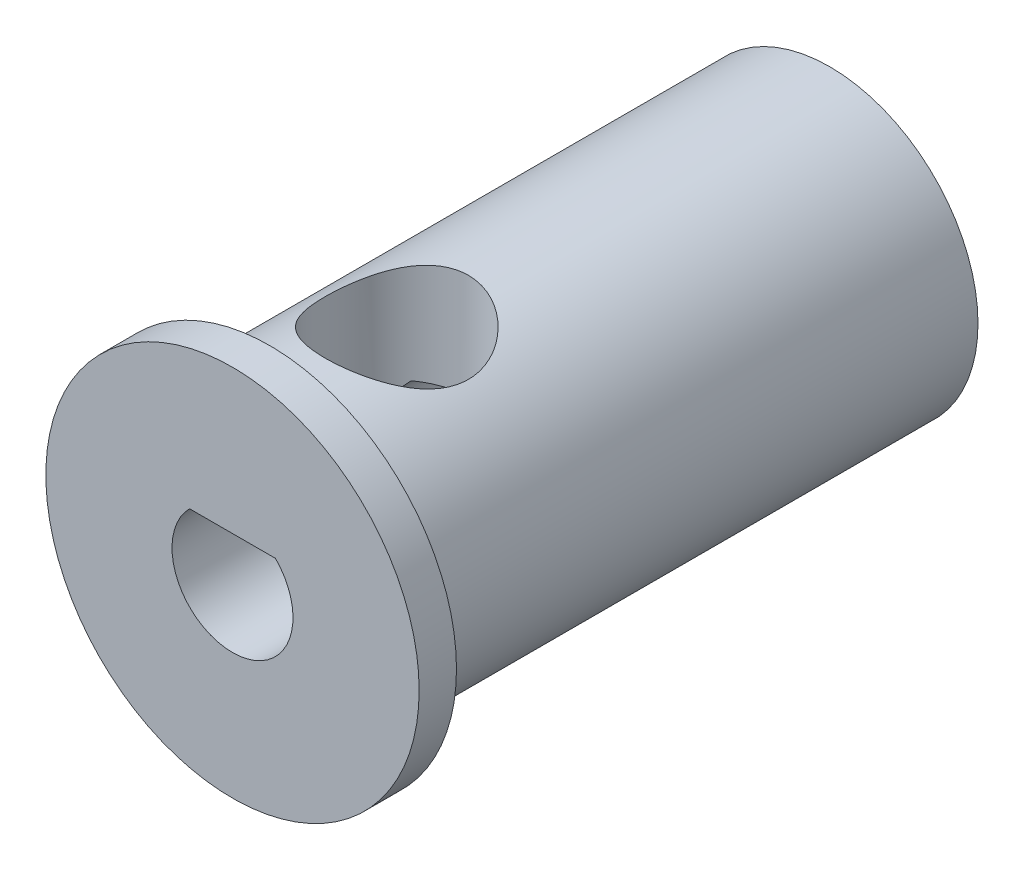
ISO-10303-21;
HEADER;
FILE_DESCRIPTION(('STEP AP214'),'2;1');
FILE_NAME('part.step','',(''),(''),'','','');
FILE_SCHEMA(('AUTOMOTIVE_DESIGN { 1 0 10303 214 1 1 1 1 }'));
ENDSEC;
DATA;
#1=APPLICATION_CONTEXT('core data for automotive mechanical design processes');
#2=APPLICATION_PROTOCOL_DEFINITION('international standard','automotive_design',2000,#1);
#3=PRODUCT_CONTEXT('',#1,'mechanical');
#4=PRODUCT('Part','Part','',(#3));
#5=PRODUCT_RELATED_PRODUCT_CATEGORY('part','',(#4));
#6=PRODUCT_DEFINITION_FORMATION('','',#4);
#7=PRODUCT_DEFINITION_CONTEXT('part definition',#1,'design');
#8=PRODUCT_DEFINITION('design','',#6,#7);
#9=PRODUCT_DEFINITION_SHAPE('','',#8);
#10=(LENGTH_UNIT() NAMED_UNIT(*) SI_UNIT(.MILLI.,.METRE.));
#11=(NAMED_UNIT(*) PLANE_ANGLE_UNIT() SI_UNIT($,.RADIAN.));
#12=(NAMED_UNIT(*) SI_UNIT($,.STERADIAN.) SOLID_ANGLE_UNIT());
#13=UNCERTAINTY_MEASURE_WITH_UNIT(LENGTH_MEASURE(1.E-05),#10,'distance_accuracy_value','');
#14=(GEOMETRIC_REPRESENTATION_CONTEXT(3) GLOBAL_UNCERTAINTY_ASSIGNED_CONTEXT((#13)) GLOBAL_UNIT_ASSIGNED_CONTEXT((#10,
#11,#12)) REPRESENTATION_CONTEXT('',''));
#15=CARTESIAN_POINT('',(0.,0.,0.));
#16=DIRECTION('',(0.,0.,1.));
#17=DIRECTION('',(1.,0.,0.));
#18=AXIS2_PLACEMENT_3D('',#15,#16,#17);
#19=CARTESIAN_POINT('',(0.,0.,19.05));
#20=DIRECTION('',(0.,0.,-1.));
#21=DIRECTION('',(-1.,0.,0.));
#22=AXIS2_PLACEMENT_3D('',#19,#20,#21);
#23=CYLINDRICAL_SURFACE('',#22,2.0574);
#24=CARTESIAN_POINT('',(-1.46176944830572,1.4478,16.6836722675695));
#25=CARTESIAN_POINT('',(-1.50519206628819,1.40393112188125,16.6511612609502));
#26=CARTESIAN_POINT('',(-1.54641966982627,1.35838515069615,16.6180095134758));
#27=CARTESIAN_POINT('',(-1.62452478522064,1.26395928808297,16.5511611275381));
#28=CARTESIAN_POINT('',(-1.66139721220871,1.21507560273191,16.5174639033702));
#29=CARTESIAN_POINT('',(-1.7312439647107,1.11334995902762,16.4498437644032));
#30=CARTESIAN_POINT('',(-1.7641526047677,1.060460167501,16.4159248775956));
#31=CARTESIAN_POINT('',(-1.82532169227734,0.951318476338173,16.3494161396357));
#32=CARTESIAN_POINT('',(-1.85358526275403,0.895068870586818,16.3168254067026));
#33=CARTESIAN_POINT('',(-1.91036444974198,0.767585453453801,16.2481294222542));
#34=CARTESIAN_POINT('',(-1.93784489045503,0.695574842274011,16.2125863073743));
#35=CARTESIAN_POINT('',(-1.98508226913828,0.546287388131393,16.1486228220648));
#36=CARTESIAN_POINT('',(-2.00487272011191,0.469035159306943,16.120171743594));
#37=CARTESIAN_POINT('',(-2.03230681225367,0.326622374320476,16.0795894308021));
#38=CARTESIAN_POINT('',(-2.04164798322301,0.262437628538028,16.0652637058874));
#39=CARTESIAN_POINT('',(-2.05419099934086,0.1321281191434,16.0458632716218));
#40=CARTESIAN_POINT('',(-2.05740374432613,0.0660070126349541,16.040772138693));
#41=CARTESIAN_POINT('',(-2.0573962411417,-0.0663799692440312,16.04078384334));
#42=CARTESIAN_POINT('',(-2.05416188417866,-0.132645844419653,16.0459090382574));
#43=CARTESIAN_POINT('',(-2.04154964803655,-0.263240700814713,16.0654151297025));
#44=CARTESIAN_POINT('',(-2.03215954918969,-0.32756556273067,16.0798144351245));
#45=CARTESIAN_POINT('',(-2.00249448074515,-0.481117963792243,16.1236794548613));
#46=CARTESIAN_POINT('',(-1.97923062323135,-0.568629847005579,16.1570023703137));
#47=CARTESIAN_POINT('',(-1.92301273529276,-0.736772826713629,16.2320061803082));
#48=CARTESIAN_POINT('',(-1.89002324061015,-0.817377322332805,16.2737174827598));
#49=CARTESIAN_POINT('',(-1.82412384580341,-0.953811916607055,16.3507359800795));
#50=CARTESIAN_POINT('',(-1.79303208807592,-1.01099981570697,16.3852317827931));
#51=CARTESIAN_POINT('',(-1.72589853297051,-1.12176982261917,16.4552020662133));
#52=CARTESIAN_POINT('',(-1.68985427100158,-1.17535011521657,16.4906770271252));
#53=CARTESIAN_POINT('',(-1.57443628690646,-1.33067204160933,16.5968945713104));
#54=CARTESIAN_POINT('',(-1.48768034517329,-1.42719399728141,16.6675502997746));
#55=CARTESIAN_POINT('',(-1.31339884394821,-1.587136741894,16.7886460708021));
#56=CARTESIAN_POINT('',(-1.22929020592124,-1.65334614453058,16.8403482409517));
#57=CARTESIAN_POINT('',(-1.04863601539109,-1.77340615402986,16.9357545581393));
#58=CARTESIAN_POINT('',(-0.952112807739071,-1.82727849327907,16.9794727414331));
#59=CARTESIAN_POINT('',(-0.766945052576345,-1.9112848896966,17.0483444605489));
#60=CARTESIAN_POINT('',(-0.680187677445502,-1.94397223784251,17.0754396259506));
#61=CARTESIAN_POINT('',(-0.500794616570107,-1.99771012938167,17.1202048118993));
#62=CARTESIAN_POINT('',(-0.408162400749684,-2.01876747187716,17.1378803391169));
#63=CARTESIAN_POINT('',(-0.218967211244996,-2.0479618824641,17.1624288772043));
#64=CARTESIAN_POINT('',(-0.122387155504576,-2.05603493820469,17.1692483662838));
#65=CARTESIAN_POINT('',(0.0710651366325389,-2.058444991503,17.1712815774507));
#66=CARTESIAN_POINT('',(0.167937329056345,-2.05278396242986,17.1664969668624));
#67=CARTESIAN_POINT('',(0.351055338617932,-2.02916190407631,17.1466143564099));
#68=CARTESIAN_POINT('',(0.437531599879201,-2.01222024763185,17.1323713295755));
#69=CARTESIAN_POINT('',(0.605917128118689,-1.96808046889884,17.0954919130068));
#70=CARTESIAN_POINT('',(0.687825688732149,-1.94088076529193,17.0728542292121));
#71=CARTESIAN_POINT('',(0.851308426574243,-1.87522758570068,17.0187023899565));
#72=CARTESIAN_POINT('',(0.932439790078999,-1.83610841383023,16.9866692175147));
#73=CARTESIAN_POINT('',(1.08692033994308,-1.74910618550832,16.9164030874487));
#74=CARTESIAN_POINT('',(1.16026373095412,-1.7012166738969,16.8781655656681));
#75=CARTESIAN_POINT('',(1.33259339246107,-1.57277579097107,16.7775361604538));
#76=CARTESIAN_POINT('',(1.42664164448741,-1.48768557728443,16.7124588184173));
#77=CARTESIAN_POINT('',(1.59666597224789,-1.30358481103171,16.5781309524719));
#78=CARTESIAN_POINT('',(1.67260009201605,-1.20454277045228,16.5088711970223));
#79=CARTESIAN_POINT('',(1.79248474438531,-1.01478515218845,16.3868545202333));
#80=CARTESIAN_POINT('',(1.83979973191277,-0.92648882539618,16.3336119120111));
#81=CARTESIAN_POINT('',(1.92206508897937,-0.74083005882924,16.2338622019753));
#82=CARTESIAN_POINT('',(1.9570530464539,-0.643496343493173,16.1873348844232));
#83=CARTESIAN_POINT('',(2.00218355544554,-0.477962013063402,16.1241073242486));
#84=CARTESIAN_POINT('',(2.01671446228039,-0.412762090219479,16.1027933516637));
#85=CARTESIAN_POINT('',(2.03949288253413,-0.279163558741945,16.0686704453499));
#86=CARTESIAN_POINT('',(2.04775599300597,-0.210773342625285,16.0558404101093));
#87=CARTESIAN_POINT('',(2.05734223816155,-0.0716229439490773,16.0409047407842));
#88=CARTESIAN_POINT('',(2.05860012818988,-0.000846637597273574,16.0388999350702));
#89=CARTESIAN_POINT('',(2.05385075392474,0.139867521487288,16.0463451827528));
#90=CARTESIAN_POINT('',(2.04783681163789,0.209804543872385,16.0558057652591));
#91=CARTESIAN_POINT('',(2.0273144454087,0.360206363733491,16.0870608857868));
#92=CARTESIAN_POINT('',(2.01136272853382,0.440021817359107,16.1109226590397));
#93=CARTESIAN_POINT('',(1.9712992602855,0.594377936243893,16.167607787309));
#94=CARTESIAN_POINT('',(1.94715470433295,0.668895916100501,16.2004670650872));
#95=CARTESIAN_POINT('',(1.8969155732351,0.799067187762652,16.2645944261124));
#96=CARTESIAN_POINT('',(1.87203952543899,0.855634472978011,16.2950016823351));
#97=CARTESIAN_POINT('',(1.81782587544743,0.965483966390125,16.3577396967499));
#98=CARTESIAN_POINT('',(1.78848508798933,1.01876379077789,16.3900718180858));
#99=CARTESIAN_POINT('',(1.69409147604015,1.17369677897956,16.4881399240421));
#100=CARTESIAN_POINT('',(1.62253567207356,1.27077785784319,16.5551271820125));
#101=CARTESIAN_POINT('',(1.52958702555296,1.37609715491529,16.6310645240224));
#102=CARTESIAN_POINT('',(1.51633118394945,1.39069160233779,16.6416674825479));
#103=CARTESIAN_POINT('',(1.48938302702622,1.41951499540378,16.662757016479));
#104=CARTESIAN_POINT('',(1.47569126576392,1.43374436652407,16.6732437184435));
#105=CARTESIAN_POINT('',(1.46176944830574,1.44780000000002,16.6836722675695));
#106=B_SPLINE_CURVE_WITH_KNOTS('',3,(#24,#25,#26,#27,#28,#29,#30,#31,#32,#33,#34,#35,#36,#37,
#38,#39,#40,#41,#42,#43,#44,#45,#46,#47,#48,#49,#50,#51,#52,#53,#54,#55,#56,#57,#58,#59,#60,#61,
#62,#63,#64,#65,#66,#67,#68,#69,#70,#71,#72,#73,#74,#75,#76,#77,#78,#79,#80,#81,#82,#83,#84,#85,
#86,#87,#88,#89,#90,#91,#92,#93,#94,#95,#96,#97,#98,#99,#100,#101,#102,#103,#104,#105),
.UNSPECIFIED.,.F.,.F.,(4,2,2,2,2,2,2,2,2,2,2,2,2,2,2,2,2,2,2,2,2,2,2,2,2,2,2,2,2,2,2,2,2,2,2,2,
2,2,2,2,4),(0.,0.209214934902574,0.418671772548596,0.631225087465833,0.843634906363585,
1.09765356996514,1.35055245950274,1.54902383530508,1.74714188546865,1.94569397179676,
2.14464139917522,2.43248454886869,2.72139057411086,2.94212328547115,3.16296624400749,
3.60390394942574,3.95926812663508,4.31400141151972,4.60258642261468,4.89100254285878,
5.18083623965345,5.47062829443067,5.73725580849062,6.00392444104277,6.2896636052093,
6.57561393104608,7.00101743720801,7.42739689880439,7.76684659112921,8.10525207844378,
8.31494070033158,8.52410579658117,8.73521578041091,8.94651978169992,9.19956371837157,
9.45363305290759,9.65997056975858,9.86645598942673,10.2782338339173,10.345391351189,
10.4124666742462),.UNSPECIFIED.);
#107=CARTESIAN_POINT('',(-1.46176944830572,1.4478,16.6836722675695));
#108=VERTEX_POINT('',#107);
#109=CARTESIAN_POINT('',(1.46176944830572,1.4478,16.6836722675695));
#110=VERTEX_POINT('',#109);
#111=EDGE_CURVE('E95',#108,#110,#106,.T.);
#112=ORIENTED_EDGE('',*,*,#111,.F.);
#113=DIRECTION('',(0.,0.,-1.));
#114=VECTOR('',#113,1.);
#115=CARTESIAN_POINT('',(-1.46176944830572,1.4478,22.0364178944013));
#116=LINE('',#115,#114);
#117=CARTESIAN_POINT('',(-1.46176944830572,1.4478,20.32));
#118=VERTEX_POINT('',#117);
#119=EDGE_CURVE('E91',#118,#108,#116,.T.);
#120=ORIENTED_EDGE('',*,*,#119,.F.);
#121=CARTESIAN_POINT('',(0.,0.,20.32));
#122=DIRECTION('',(0.,0.,-1.));
#123=DIRECTION('',(-1.,0.,0.));
#124=AXIS2_PLACEMENT_3D('',#121,#122,#123);
#125=CIRCLE('',#124,2.0574);
#126=CARTESIAN_POINT('',(1.46176944830572,1.4478,20.32));
#127=VERTEX_POINT('',#126);
#128=EDGE_CURVE('E93',#127,#118,#125,.T.);
#129=ORIENTED_EDGE('',*,*,#128,.F.);
#130=DIRECTION('',(0.,0.,-1.));
#131=VECTOR('',#130,1.);
#132=CARTESIAN_POINT('',(1.46176944830572,1.4478,22.0364178944013));
#133=LINE('',#132,#131);
#134=EDGE_CURVE('E64',#127,#110,#133,.T.);
#135=ORIENTED_EDGE('',*,*,#134,.T.);
#136=EDGE_LOOP('',(#112,#120,#129,#135));
#137=FACE_BOUND('',#136,.T.);
#138=ADVANCED_FACE('F47',(#137),#23,.F.);
#139=CARTESIAN_POINT('',(-1.46176944830572,1.4478,22.0364178944013));
#140=DIRECTION('',(0.,-1.,0.));
#141=DIRECTION('',(0.,0.,-1.));
#142=AXIS2_PLACEMENT_3D('',#139,#140,#141);
#143=PLANE('',#142);
#144=CARTESIAN_POINT('',(0.,1.4478,14.732));
#145=DIRECTION('',(0.,-1.,0.));
#146=DIRECTION('',(0.,0.,-1.));
#147=AXIS2_PLACEMENT_3D('',#144,#145,#146);
#148=CIRCLE('',#147,2.4384);
#149=EDGE_CURVE('E11',#110,#108,#148,.T.);
#150=ORIENTED_EDGE('',*,*,#149,.F.);
#151=ORIENTED_EDGE('',*,*,#134,.F.);
#152=DIRECTION('',(1.,0.,0.));
#153=VECTOR('',#152,1.);
#154=CARTESIAN_POINT('',(-1.46176944830572,1.4478,20.32));
#155=LINE('',#154,#153);
#156=EDGE_CURVE('E100',#118,#127,#155,.T.);
#157=ORIENTED_EDGE('',*,*,#156,.F.);
#158=ORIENTED_EDGE('',*,*,#119,.T.);
#159=EDGE_LOOP('',(#150,#151,#157,#158));
#160=FACE_BOUND('',#159,.T.);
#161=ADVANCED_FACE('F101',(#160),#143,.T.);
#162=CARTESIAN_POINT('',(0.,0.,0.));
#163=DIRECTION('',(0.,0.,1.));
#164=DIRECTION('',(1.,0.,0.));
#165=AXIS2_PLACEMENT_3D('',#162,#163,#164);
#166=PLANE('',#165);
#167=CARTESIAN_POINT('',(0.,0.,0.));
#168=DIRECTION('',(0.,0.,1.));
#169=DIRECTION('',(1.,0.,0.));
#170=AXIS2_PLACEMENT_3D('',#167,#168,#169);
#171=CIRCLE('',#170,5.0419);
#172=CARTESIAN_POINT('',(5.0419,0.,0.));
#173=VERTEX_POINT('',#172);
#174=EDGE_CURVE('E169',#173,#173,#171,.T.);
#175=ORIENTED_EDGE('',*,*,#174,.F.);
#176=EDGE_LOOP('',(#175));
#177=FACE_BOUND('',#176,.T.);
#178=CARTESIAN_POINT('',(0.,0.,0.));
#179=DIRECTION('',(0.,0.,1.));
#180=DIRECTION('',(1.,0.,0.));
#181=AXIS2_PLACEMENT_3D('',#178,#179,#180);
#182=CIRCLE('',#181,2.0574);
#183=CARTESIAN_POINT('',(-1.46176944830572,1.4478,0.));
#184=VERTEX_POINT('',#183);
#185=CARTESIAN_POINT('',(1.46176944830572,1.4478,0.));
#186=VERTEX_POINT('',#185);
#187=EDGE_CURVE('E165',#184,#186,#182,.T.);
#188=ORIENTED_EDGE('',*,*,#187,.T.);
#189=DIRECTION('',(-1.,0.,0.));
#190=VECTOR('',#189,1.);
#191=CARTESIAN_POINT('',(-1.46176944830572,1.4478,0.));
#192=LINE('',#191,#190);
#193=EDGE_CURVE('E159',#186,#184,#192,.T.);
#194=ORIENTED_EDGE('',*,*,#193,.T.);
#195=EDGE_LOOP('',(#188,#194));
#196=FACE_BOUND('',#195,.T.);
#197=ADVANCED_FACE('F178',(#177,#196),#166,.F.);
#198=CARTESIAN_POINT('',(0.,0.,19.05));
#199=DIRECTION('',(0.,0.,-1.));
#200=DIRECTION('',(-1.,0.,0.));
#201=AXIS2_PLACEMENT_3D('',#198,#199,#200);
#202=CYLINDRICAL_SURFACE('',#201,5.0419);
#203=CARTESIAN_POINT('',(0.,5.0419,12.2936));
#204=CARTESIAN_POINT('',(0.128686564359086,5.0418925428462,12.2936088796131));
#205=CARTESIAN_POINT('',(0.257546349033025,5.0369191741596,12.3038479178414));
#206=CARTESIAN_POINT('',(0.511486174983524,5.0175132670175,12.3443689212871));
#207=CARTESIAN_POINT('',(0.636557876986406,5.00306125026154,12.3746921601237));
#208=CARTESIAN_POINT('',(0.8788582103352,4.96621839908015,12.4539337905763));
#209=CARTESIAN_POINT('',(0.996114670527275,4.94385774384648,12.5027815435304));
#210=CARTESIAN_POINT('',(1.22060918826055,4.89327383858044,12.617336141086));
#211=CARTESIAN_POINT('',(1.32784846639761,4.86505130417384,12.6830409279892));
#212=CARTESIAN_POINT('',(1.53622543859915,4.80346152445666,12.8337688110096));
#213=CARTESIAN_POINT('',(1.63665452061094,4.76989143939795,12.9196875183052));
#214=CARTESIAN_POINT('',(1.82232280133924,4.70209348214433,13.1064855301581));
#215=CARTESIAN_POINT('',(1.90755122030683,4.66786516205997,13.2073753595251));
#216=CARTESIAN_POINT('',(2.06647809093927,4.59982870366338,13.4299027389843));
#217=CARTESIAN_POINT('',(2.13892055437825,4.56622467076544,13.5525068771764));
#218=CARTESIAN_POINT('',(2.26185116301421,4.50660458404742,13.8099730593886));
#219=CARTESIAN_POINT('',(2.31235420206546,4.48058338648698,13.9448267122415));
#220=CARTESIAN_POINT('',(2.38681781174366,4.44134512038458,14.2149370406873));
#221=CARTESIAN_POINT('',(2.41214855845617,4.42747266137765,14.3497162236765));
#222=CARTESIAN_POINT('',(2.43976841870203,4.41231941964661,14.6222675654147));
#223=CARTESIAN_POINT('',(2.44207778101067,4.4110275714963,14.7600369871303));
#224=CARTESIAN_POINT('',(2.42459880543812,4.42064791137827,15.0183781777498));
#225=CARTESIAN_POINT('',(2.40721496118064,4.4302323537919,15.1391736513211));
#226=CARTESIAN_POINT('',(2.35498121745502,4.45821576891181,15.3758571757985));
#227=CARTESIAN_POINT('',(2.32012632207866,4.47661726281841,15.49174381272));
#228=CARTESIAN_POINT('',(2.2332757452246,4.52057966025992,15.7185998590791));
#229=CARTESIAN_POINT('',(2.18089970041237,4.54629734962804,15.8293918463229));
#230=CARTESIAN_POINT('',(2.06077840393529,4.60199152286105,16.0411295252715));
#231=CARTESIAN_POINT('',(1.99302631035624,4.63196990038751,16.1420708050048));
#232=CARTESIAN_POINT('',(1.83477092334898,4.69707496001088,16.3437412803088));
#233=CARTESIAN_POINT('',(1.74252896545128,4.7323924558487,16.4430491243422));
#234=CARTESIAN_POINT('',(1.54250509264387,4.80131478130132,16.6253550541619));
#235=CARTESIAN_POINT('',(1.43471667700474,4.83491888646843,16.7083462827015));
#236=CARTESIAN_POINT('',(1.20104600301171,4.89831280579136,16.8588187085972));
#237=CARTESIAN_POINT('',(1.07460444944632,4.92789070855487,16.9255277581858));
#238=CARTESIAN_POINT('',(0.810497939326109,4.97813833979729,17.0362013666258));
#239=CARTESIAN_POINT('',(0.672841435618257,4.99881470494224,17.0801828752315));
#240=CARTESIAN_POINT('',(0.401901038278728,5.02755429529302,17.140731759672));
#241=CARTESIAN_POINT('',(0.269133282683795,5.03648623857137,17.1591932564165));
#242=CARTESIAN_POINT('',(0.00210248923947996,5.04366522955705,17.1740581658439));
#243=CARTESIAN_POINT('',(-0.13215988155064,5.04191686706049,17.1704710537775));
#244=CARTESIAN_POINT('',(-0.388188206194951,5.02845280191247,17.142498322187));
#245=CARTESIAN_POINT('',(-0.510161623154806,5.01745816489106,17.1196170135432));
#246=CARTESIAN_POINT('',(-0.748315401260187,4.98750350529238,17.056008376961));
#247=CARTESIAN_POINT('',(-0.864495102927093,4.96854257824444,17.0152790225821));
#248=CARTESIAN_POINT('',(-1.09174412368665,4.92368481268729,16.9159706947035));
#249=CARTESIAN_POINT('',(-1.20255807546908,4.89759816758167,16.856896092721));
#250=CARTESIAN_POINT('',(-1.41308199604515,4.84105931038253,16.7231220401614));
#251=CARTESIAN_POINT('',(-1.51278709976117,4.81060519882331,16.6484157846599));
#252=CARTESIAN_POINT('',(-1.70809933485676,4.74496892412052,16.4774419532528));
#253=CARTESIAN_POINT('',(-1.80245878848453,4.70961062509264,16.3798138850598));
#254=CARTESIAN_POINT('',(-1.97397629723725,4.64033913613352,16.1699139539607));
#255=CARTESIAN_POINT('',(-2.05112433020688,4.60642679742779,16.0576336190787));
#256=CARTESIAN_POINT('',(-2.18888680309277,4.54263534541739,15.8158295434023));
#257=CARTESIAN_POINT('',(-2.24871222415087,4.5129730805269,15.6857941777655));
#258=CARTESIAN_POINT('',(-2.34499439767787,4.46371237651351,15.4155933271357));
#259=CARTESIAN_POINT('',(-2.38147924081374,4.44410184568193,15.2754402459756));
#260=CARTESIAN_POINT('',(-2.42684463055211,4.41947811052812,15.0030426554437));
#261=CARTESIAN_POINT('',(-2.43798758662459,4.41327130312442,14.8712842714336));
#262=CARTESIAN_POINT('',(-2.43878938587982,4.41283025953259,14.6077028012347));
#263=CARTESIAN_POINT('',(-2.42845573247494,4.41859184187572,14.4758797537249));
#264=CARTESIAN_POINT('',(-2.38867652832737,4.44020431774729,14.2275081231121));
#265=CARTESIAN_POINT('',(-2.36090481591439,4.45516942899351,14.1106051592111));
#266=CARTESIAN_POINT('',(-2.28901242387435,4.49252815747299,13.883208489142));
#267=CARTESIAN_POINT('',(-2.24488671214535,4.51492406092782,13.7727167678193));
#268=CARTESIAN_POINT('',(-2.13819665532438,4.56646435141538,13.5531012981038));
#269=CARTESIAN_POINT('',(-2.07459359107575,4.5959607736721,13.4445670253615));
#270=CARTESIAN_POINT('',(-1.93196196890988,4.65771606228086,13.2390209905099));
#271=CARTESIAN_POINT('',(-1.85292573386858,4.68997629897218,13.1420150018574));
#272=CARTESIAN_POINT('',(-1.67136209237692,4.75790793983511,12.9511154012015));
#273=CARTESIAN_POINT('',(-1.56720186259729,4.79356106564276,12.8587587883146));
#274=CARTESIAN_POINT('',(-1.34381426231172,4.86092015297226,12.692548612215));
#275=CARTESIAN_POINT('',(-1.22457936690323,4.8926241273745,12.6187043452063));
#276=CARTESIAN_POINT('',(-0.973587981384052,4.94867063919014,12.4919936323518));
#277=CARTESIAN_POINT('',(-0.841826233432079,4.97301006742774,12.4391360437634));
#278=CARTESIAN_POINT('',(-0.638107180193241,5.00183096610256,12.37750156966));
#279=CARTESIAN_POINT('',(-0.569241310079788,5.01015323509035,12.359905241195));
#280=CARTESIAN_POINT('',(-0.429981409160093,5.02401720495238,12.3307592150679));
#281=CARTESIAN_POINT('',(-0.359588380966093,5.02956067578039,12.3192056682556));
#282=CARTESIAN_POINT('',(-0.240901687266398,5.03637001303052,12.3050501689107));
#283=CARTESIAN_POINT('',(-0.192847442673052,5.03844018303749,12.3007601226674));
#284=CARTESIAN_POINT('',(-0.0965369296162585,5.04120659279179,12.295033336388));
#285=CARTESIAN_POINT('',(-0.0482806560722773,5.04190279777675,12.2935966685446));
#286=CARTESIAN_POINT('',(0.,5.0419,12.2936));
#287=B_SPLINE_CURVE_WITH_KNOTS('',3,(#203,#204,#205,#206,#207,#208,#209,#210,#211,#212,#213,
#214,#215,#216,#217,#218,#219,#220,#221,#222,#223,#224,#225,#226,#227,#228,#229,#230,#231,#232,
#233,#234,#235,#236,#237,#238,#239,#240,#241,#242,#243,#244,#245,#246,#247,#248,#249,#250,#251,
#252,#253,#254,#255,#256,#257,#258,#259,#260,#261,#262,#263,#264,#265,#266,#267,#268,#269,#270,
#271,#272,#273,#274,#275,#276,#277,#278,#279,#280,#281,#282,#283,#284,#285,#286),.UNSPECIFIED.,
.T.,.F.,(4,2,2,2,2,2,2,2,2,2,2,2,2,2,2,2,2,2,2,2,2,2,2,2,2,2,2,2,2,2,2,2,2,2,2,2,2,2,2,2,2,4),
(0.,0.385871798047209,0.772539044547824,1.15774642017165,1.54290679679421,1.95028091975094,
2.35794279853337,2.79468175548711,3.23112376161768,3.64223936181008,4.05299332768273,
4.41853220607881,4.78417567127813,5.15833639984606,5.53266394711412,5.95101892639689,
6.36954935013464,6.80517812478479,7.24048154545553,7.64133444108011,8.04201508474567,
8.41406813148903,8.78616343153254,9.16934425528211,9.55269223740896,9.97176291523253,
10.3910769833244,10.8272418353245,11.2628807651967,11.657779753948,12.0525407976554,
12.4142266637043,12.7760239124918,13.162102349921,13.5483733309137,13.9774625991374,
14.4067669101781,14.8362522135158,15.0506776475044,15.2649663292463,15.4097341402705,
15.5545056139849),.UNSPECIFIED.);
#288=CARTESIAN_POINT('',(0.,5.0419,12.2936));
#289=VERTEX_POINT('',#288);
#290=EDGE_CURVE('E152',#289,#289,#287,.T.);
#291=ORIENTED_EDGE('',*,*,#290,.T.);
#292=EDGE_LOOP('',(#291));
#293=FACE_BOUND('',#292,.T.);
#294=CARTESIAN_POINT('',(0.,-5.04190000000001,12.2936));
#295=CARTESIAN_POINT('',(-0.128686564359084,-5.04189254284621,12.2936088796131));
#296=CARTESIAN_POINT('',(-0.257546349033023,-5.0369191741596,12.3038479178414));
#297=CARTESIAN_POINT('',(-0.511486174983522,-5.0175132670175,12.3443689212871));
#298=CARTESIAN_POINT('',(-0.636557876986404,-5.00306125026154,12.3746921601237));
#299=CARTESIAN_POINT('',(-0.878858210335198,-4.96621839908016,12.4539337905763));
#300=CARTESIAN_POINT('',(-0.996114670527273,-4.94385774384648,12.5027815435304));
#301=CARTESIAN_POINT('',(-1.22060918826054,-4.89327383858045,12.617336141086));
#302=CARTESIAN_POINT('',(-1.32784846639761,-4.86505130417384,12.6830409279892));
#303=CARTESIAN_POINT('',(-1.53622543859915,-4.80346152445666,12.8337688110096));
#304=CARTESIAN_POINT('',(-1.63665452061094,-4.76989143939795,12.9196875183052));
#305=CARTESIAN_POINT('',(-1.82232280133924,-4.70209348214433,13.1064855301581));
#306=CARTESIAN_POINT('',(-1.90755122030683,-4.66786516205997,13.2073753595251));
#307=CARTESIAN_POINT('',(-2.06647809093927,-4.59982870366339,13.4299027389843));
#308=CARTESIAN_POINT('',(-2.13892055437825,-4.56622467076544,13.5525068771764));
#309=CARTESIAN_POINT('',(-2.26185116301421,-4.50660458404743,13.8099730593886));
#310=CARTESIAN_POINT('',(-2.31235420206546,-4.48058338648698,13.9448267122415));
#311=CARTESIAN_POINT('',(-2.38681781174366,-4.44134512038458,14.2149370406873));
#312=CARTESIAN_POINT('',(-2.41214855845617,-4.42747266137765,14.3497162236765));
#313=CARTESIAN_POINT('',(-2.43976841870202,-4.41231941964661,14.6222675654147));
#314=CARTESIAN_POINT('',(-2.44207778101067,-4.4110275714963,14.7600369871303));
#315=CARTESIAN_POINT('',(-2.42459880543811,-4.42064791137827,15.0183781777498));
#316=CARTESIAN_POINT('',(-2.40721496118064,-4.4302323537919,15.1391736513211));
#317=CARTESIAN_POINT('',(-2.35498121745502,-4.45821576891181,15.3758571757985));
#318=CARTESIAN_POINT('',(-2.32012632207866,-4.47661726281842,15.49174381272));
#319=CARTESIAN_POINT('',(-2.23327574522459,-4.52057966025992,15.7185998590791));
#320=CARTESIAN_POINT('',(-2.18089970041236,-4.54629734962804,15.8293918463229));
#321=CARTESIAN_POINT('',(-2.06077840393529,-4.60199152286105,16.0411295252715));
#322=CARTESIAN_POINT('',(-1.99302631035623,-4.63196990038751,16.1420708050048));
#323=CARTESIAN_POINT('',(-1.83477092334898,-4.69707496001088,16.3437412803088));
#324=CARTESIAN_POINT('',(-1.74252896545128,-4.73239245584871,16.4430491243422));
#325=CARTESIAN_POINT('',(-1.54250509264387,-4.80131478130133,16.6253550541619));
#326=CARTESIAN_POINT('',(-1.43471667700474,-4.83491888646843,16.7083462827015));
#327=CARTESIAN_POINT('',(-1.20104600301171,-4.89831280579136,16.8588187085972));
#328=CARTESIAN_POINT('',(-1.07460444944633,-4.92789070855487,16.9255277581858));
#329=CARTESIAN_POINT('',(-0.81049793932611,-4.97813833979729,17.0362013666258));
#330=CARTESIAN_POINT('',(-0.672841435618258,-4.99881470494224,17.0801828752315));
#331=CARTESIAN_POINT('',(-0.401901038278729,-5.02755429529302,17.140731759672));
#332=CARTESIAN_POINT('',(-0.269133282683795,-5.03648623857137,17.1591932564165));
#333=CARTESIAN_POINT('',(-0.00210248923948001,-5.04366522955705,17.1740581658439));
#334=CARTESIAN_POINT('',(0.13215988155064,-5.04191686706049,17.1704710537775));
#335=CARTESIAN_POINT('',(0.388188206194953,-5.02845280191247,17.142498322187));
#336=CARTESIAN_POINT('',(0.510161623154807,-5.01745816489106,17.1196170135432));
#337=CARTESIAN_POINT('',(0.748315401260188,-4.98750350529238,17.056008376961));
#338=CARTESIAN_POINT('',(0.864495102927095,-4.96854257824444,17.0152790225821));
#339=CARTESIAN_POINT('',(1.09174412368665,-4.92368481268729,16.9159706947035));
#340=CARTESIAN_POINT('',(1.20255807546908,-4.89759816758167,16.856896092721));
#341=CARTESIAN_POINT('',(1.41308199604514,-4.84105931038253,16.7231220401614));
#342=CARTESIAN_POINT('',(1.51278709976117,-4.81060519882331,16.6484157846599));
#343=CARTESIAN_POINT('',(1.70809933485676,-4.74496892412051,16.4774419532528));
#344=CARTESIAN_POINT('',(1.80245878848454,-4.70961062509264,16.3798138850598));
#345=CARTESIAN_POINT('',(1.97397629723725,-4.64033913613352,16.1699139539607));
#346=CARTESIAN_POINT('',(2.05112433020688,-4.60642679742779,16.0576336190787));
#347=CARTESIAN_POINT('',(2.18888680309277,-4.54263534541739,15.8158295434023));
#348=CARTESIAN_POINT('',(2.24871222415087,-4.5129730805269,15.6857941777655));
#349=CARTESIAN_POINT('',(2.34499439767787,-4.46371237651351,15.4155933271357));
#350=CARTESIAN_POINT('',(2.38147924081374,-4.44410184568193,15.2754402459756));
#351=CARTESIAN_POINT('',(2.42684463055211,-4.41947811052812,15.0030426554437));
#352=CARTESIAN_POINT('',(2.43798758662459,-4.41327130312442,14.8712842714336));
#353=CARTESIAN_POINT('',(2.43878938587982,-4.41283025953259,14.6077028012347));
#354=CARTESIAN_POINT('',(2.42845573247494,-4.41859184187572,14.4758797537249));
#355=CARTESIAN_POINT('',(2.38867652832737,-4.44020431774729,14.2275081231121));
#356=CARTESIAN_POINT('',(2.36090481591439,-4.45516942899351,14.1106051592111));
#357=CARTESIAN_POINT('',(2.28901242387435,-4.49252815747299,13.883208489142));
#358=CARTESIAN_POINT('',(2.24488671214535,-4.51492406092782,13.7727167678193));
#359=CARTESIAN_POINT('',(2.13819665532438,-4.56646435141538,13.5531012981038));
#360=CARTESIAN_POINT('',(2.07459359107575,-4.5959607736721,13.4445670253615));
#361=CARTESIAN_POINT('',(1.93196196890988,-4.65771606228086,13.2390209905099));
#362=CARTESIAN_POINT('',(1.85292573386858,-4.68997629897218,13.1420150018574));
#363=CARTESIAN_POINT('',(1.67136209237692,-4.75790793983511,12.9511154012015));
#364=CARTESIAN_POINT('',(1.56720186259729,-4.79356106564276,12.8587587883145));
#365=CARTESIAN_POINT('',(1.34381426231172,-4.86092015297226,12.692548612215));
#366=CARTESIAN_POINT('',(1.22457936690324,-4.8926241273745,12.6187043452063));
#367=CARTESIAN_POINT('',(0.973587981384054,-4.94867063919014,12.4919936323518));
#368=CARTESIAN_POINT('',(0.84182623343208,-4.97301006742774,12.4391360437634));
#369=CARTESIAN_POINT('',(0.638107180193242,-5.00183096610256,12.37750156966));
#370=CARTESIAN_POINT('',(0.569241310079788,-5.01015323509035,12.359905241195));
#371=CARTESIAN_POINT('',(0.429981409160092,-5.02401720495238,12.3307592150679));
#372=CARTESIAN_POINT('',(0.359588380966093,-5.02956067578039,12.3192056682556));
#373=CARTESIAN_POINT('',(0.240901687266399,-5.03637001303052,12.3050501689107));
#374=CARTESIAN_POINT('',(0.192847442673053,-5.03844018303749,12.3007601226674));
#375=CARTESIAN_POINT('',(0.0965369296162597,-5.04120659279179,12.295033336388));
#376=CARTESIAN_POINT('',(0.0482806560722787,-5.04190279777676,12.2935966685446));
#377=CARTESIAN_POINT('',(0.,-5.04190000000001,12.2936));
#378=B_SPLINE_CURVE_WITH_KNOTS('',3,(#294,#295,#296,#297,#298,#299,#300,#301,#302,#303,#304,
#305,#306,#307,#308,#309,#310,#311,#312,#313,#314,#315,#316,#317,#318,#319,#320,#321,#322,#323,
#324,#325,#326,#327,#328,#329,#330,#331,#332,#333,#334,#335,#336,#337,#338,#339,#340,#341,#342,
#343,#344,#345,#346,#347,#348,#349,#350,#351,#352,#353,#354,#355,#356,#357,#358,#359,#360,#361,
#362,#363,#364,#365,#366,#367,#368,#369,#370,#371,#372,#373,#374,#375,#376,#377),.UNSPECIFIED.,
.T.,.F.,(4,2,2,2,2,2,2,2,2,2,2,2,2,2,2,2,2,2,2,2,2,2,2,2,2,2,2,2,2,2,2,2,2,2,2,2,2,2,2,2,2,4),
(0.,0.385871798047209,0.772539044547824,1.15774642017165,1.54290679679421,1.95028091975094,
2.35794279853337,2.79468175548711,3.23112376161768,3.64223936181008,4.05299332768273,
4.41853220607881,4.78417567127814,5.15833639984606,5.53266394711412,5.95101892639689,
6.36954935013464,6.80517812478478,7.24048154545553,7.64133444108011,8.04201508474566,
8.41406813148903,8.78616343153254,9.16934425528211,9.55269223740896,9.97176291523253,
10.3910769833244,10.8272418353245,11.2628807651967,11.6577797539481,12.0525407976554,
12.4142266637043,12.7760239124918,13.162102349921,13.5483733309137,13.9774625991374,
14.4067669101781,14.8362522135158,15.0506776475044,15.2649663292463,15.4097341402705,
15.5545056139849),.UNSPECIFIED.);
#379=CARTESIAN_POINT('',(0.,-5.04190000000001,12.2936));
#380=VERTEX_POINT('',#379);
#381=EDGE_CURVE('E146',#380,#380,#378,.T.);
#382=ORIENTED_EDGE('',*,*,#381,.T.);
#383=EDGE_LOOP('',(#382));
#384=FACE_BOUND('',#383,.T.);
#385=CARTESIAN_POINT('',(0.,0.,19.05));
#386=DIRECTION('',(0.,0.,1.));
#387=DIRECTION('',(1.,0.,0.));
#388=AXIS2_PLACEMENT_3D('',#385,#386,#387);
#389=CIRCLE('',#388,5.0419);
#390=CARTESIAN_POINT('',(5.0419,0.,19.05));
#391=VERTEX_POINT('',#390);
#392=EDGE_CURVE('E170',#391,#391,#389,.T.);
#393=ORIENTED_EDGE('',*,*,#392,.F.);
#394=EDGE_LOOP('',(#393));
#395=FACE_BOUND('',#394,.T.);
#396=ORIENTED_EDGE('',*,*,#174,.T.);
#397=EDGE_LOOP('',(#396));
#398=FACE_BOUND('',#397,.T.);
#399=ADVANCED_FACE('F49',(#293,#384,#395,#398),#202,.T.);
#400=CARTESIAN_POINT('',(1.46176944830572,1.4478,12.7803277324305));
#401=CARTESIAN_POINT('',(1.50519206628819,1.40393112188125,12.8128387390498));
#402=CARTESIAN_POINT('',(1.54641966982626,1.35838515069615,12.8459904865242));
#403=CARTESIAN_POINT('',(1.62452478522064,1.26395928808297,12.9128388724619));
#404=CARTESIAN_POINT('',(1.66139721220871,1.21507560273192,12.9465360966298));
#405=CARTESIAN_POINT('',(1.7312439647107,1.11334995902762,13.0141562355968));
#406=CARTESIAN_POINT('',(1.7641526047677,1.060460167501,13.0480751224043));
#407=CARTESIAN_POINT('',(1.82532169227734,0.951318476338172,13.1145838603643));
#408=CARTESIAN_POINT('',(1.85358526275403,0.895068870586819,13.1471745932974));
#409=CARTESIAN_POINT('',(1.91036444974198,0.767585453453802,13.2158705777458));
#410=CARTESIAN_POINT('',(1.93784489045503,0.695574842274011,13.2514136926257));
#411=CARTESIAN_POINT('',(1.98508226913828,0.546287388131392,13.3153771779352));
#412=CARTESIAN_POINT('',(2.00487272011191,0.469035159306942,13.343828256406));
#413=CARTESIAN_POINT('',(2.03230681225367,0.326622374320476,13.3844105691979));
#414=CARTESIAN_POINT('',(2.04164798322301,0.262437628538028,13.3987362941126));
#415=CARTESIAN_POINT('',(2.05419099934086,0.1321281191434,13.4181367283782));
#416=CARTESIAN_POINT('',(2.05740374432613,0.0660070126349538,13.423227861307));
#417=CARTESIAN_POINT('',(2.0573962411417,-0.0663799692440313,13.42321615666));
#418=CARTESIAN_POINT('',(2.05416188417866,-0.132645844419653,13.4180909617426));
#419=CARTESIAN_POINT('',(2.04154964803655,-0.263240700814713,13.3985848702976));
#420=CARTESIAN_POINT('',(2.03215954918969,-0.32756556273067,13.3841855648755));
#421=CARTESIAN_POINT('',(2.00249448074515,-0.481117963792243,13.3403205451387));
#422=CARTESIAN_POINT('',(1.97923062323135,-0.56862984700558,13.3069976296863));
#423=CARTESIAN_POINT('',(1.92301273529276,-0.736772826713629,13.2319938196918));
#424=CARTESIAN_POINT('',(1.89002324061015,-0.817377322332804,13.1902825172402));
#425=CARTESIAN_POINT('',(1.82412384580341,-0.953811916607054,13.1132640199205));
#426=CARTESIAN_POINT('',(1.79303208807592,-1.01099981570697,13.0787682172069));
#427=CARTESIAN_POINT('',(1.72589853297051,-1.12176982261917,13.0087979337867));
#428=CARTESIAN_POINT('',(1.68985427100159,-1.17535011521656,12.9733229728748));
#429=CARTESIAN_POINT('',(1.57443628690646,-1.33067204160933,12.8671054286896));
#430=CARTESIAN_POINT('',(1.48768034517329,-1.42719399728141,12.7964497002254));
#431=CARTESIAN_POINT('',(1.31339884394821,-1.587136741894,12.6753539291979));
#432=CARTESIAN_POINT('',(1.22929020592124,-1.65334614453058,12.6236517590483));
#433=CARTESIAN_POINT('',(1.0486360153911,-1.77340615402986,12.5282454418607));
#434=CARTESIAN_POINT('',(0.952112807739072,-1.82727849327907,12.4845272585669));
#435=CARTESIAN_POINT('',(0.766945052576345,-1.9112848896966,12.4156555394511));
#436=CARTESIAN_POINT('',(0.680187677445502,-1.94397223784251,12.3885603740494));
#437=CARTESIAN_POINT('',(0.500794616570107,-1.99771012938167,12.3437951881007));
#438=CARTESIAN_POINT('',(0.408162400749684,-2.01876747187716,12.3261196608831));
#439=CARTESIAN_POINT('',(0.218967211244995,-2.0479618824641,12.3015711227957));
#440=CARTESIAN_POINT('',(0.122387155504575,-2.05603493820469,12.2947516337162));
#441=CARTESIAN_POINT('',(-0.0710651366325397,-2.058444991503,12.2927184225493));
#442=CARTESIAN_POINT('',(-0.167937329056346,-2.05278396242986,12.2975030331376));
#443=CARTESIAN_POINT('',(-0.351055338617933,-2.02916190407631,12.3173856435901));
#444=CARTESIAN_POINT('',(-0.437531599879203,-2.01222024763185,12.3316286704245));
#445=CARTESIAN_POINT('',(-0.60591712811869,-1.96808046889883,12.3685080869932));
#446=CARTESIAN_POINT('',(-0.68782568873215,-1.94088076529193,12.3911457707879));
#447=CARTESIAN_POINT('',(-0.851308426574243,-1.87522758570068,12.4452976100435));
#448=CARTESIAN_POINT('',(-0.932439790079,-1.83610841383023,12.4773307824853));
#449=CARTESIAN_POINT('',(-1.08692033994308,-1.74910618550832,12.5475969125513));
#450=CARTESIAN_POINT('',(-1.16026373095412,-1.7012166738969,12.5858344343319));
#451=CARTESIAN_POINT('',(-1.33259339246107,-1.57277579097107,12.6864638395462));
#452=CARTESIAN_POINT('',(-1.42664164448741,-1.48768557728443,12.7515411815827));
#453=CARTESIAN_POINT('',(-1.59666597224789,-1.30358481103171,12.8858690475281));
#454=CARTESIAN_POINT('',(-1.67260009201605,-1.20454277045228,12.9551288029777));
#455=CARTESIAN_POINT('',(-1.79248474438531,-1.01478515218845,13.0771454797667));
#456=CARTESIAN_POINT('',(-1.83979973191277,-0.92648882539618,13.1303880879889));
#457=CARTESIAN_POINT('',(-1.92206508897937,-0.74083005882924,13.2301377980247));
#458=CARTESIAN_POINT('',(-1.9570530464539,-0.643496343493174,13.2766651155768));
#459=CARTESIAN_POINT('',(-2.00218355544554,-0.477962013063404,13.3398926757514));
#460=CARTESIAN_POINT('',(-2.01671446228039,-0.412762090219481,13.3612066483363));
#461=CARTESIAN_POINT('',(-2.03949288253413,-0.279163558741947,13.3953295546501));
#462=CARTESIAN_POINT('',(-2.04775599300597,-0.210773342625287,13.4081595898907));
#463=CARTESIAN_POINT('',(-2.05734223816155,-0.071622943949079,13.4230952592158));
#464=CARTESIAN_POINT('',(-2.05860012818988,-0.000846637597275079,13.4251000649299));
#465=CARTESIAN_POINT('',(-2.05385075392474,0.139867521487287,13.4176548172472));
#466=CARTESIAN_POINT('',(-2.04783681163789,0.209804543872383,13.4081942347409));
#467=CARTESIAN_POINT('',(-2.0273144454087,0.360206363733487,13.3769391142132));
#468=CARTESIAN_POINT('',(-2.01136272853382,0.440021817359101,13.3530773409603));
#469=CARTESIAN_POINT('',(-1.9712992602855,0.594377936243887,13.296392212691));
#470=CARTESIAN_POINT('',(-1.94715470433296,0.668895916100496,13.2635329349128));
#471=CARTESIAN_POINT('',(-1.8969155732351,0.79906718776265,13.1994055738876));
#472=CARTESIAN_POINT('',(-1.87203952543899,0.855634472978009,13.1689983176649));
#473=CARTESIAN_POINT('',(-1.81782587544743,0.965483966390124,13.1062603032501));
#474=CARTESIAN_POINT('',(-1.78848508798933,1.01876379077789,13.0739281819142));
#475=CARTESIAN_POINT('',(-1.69409147604015,1.17369677897956,12.9758600759579));
#476=CARTESIAN_POINT('',(-1.62253567207356,1.27077785784319,12.9088728179875));
#477=CARTESIAN_POINT('',(-1.52958702555296,1.37609715491529,12.8329354759777));
#478=CARTESIAN_POINT('',(-1.51633118394945,1.39069160233779,12.8223325174521));
#479=CARTESIAN_POINT('',(-1.48938302702622,1.41951499540378,12.801242983521));
#480=CARTESIAN_POINT('',(-1.47569126576392,1.43374436652407,12.7907562815565));
#481=CARTESIAN_POINT('',(-1.46176944830574,1.44780000000002,12.7803277324305));
#482=B_SPLINE_CURVE_WITH_KNOTS('',3,(#400,#401,#402,#403,#404,#405,#406,#407,#408,#409,#410,
#411,#412,#413,#414,#415,#416,#417,#418,#419,#420,#421,#422,#423,#424,#425,#426,#427,#428,#429,
#430,#431,#432,#433,#434,#435,#436,#437,#438,#439,#440,#441,#442,#443,#444,#445,#446,#447,#448,
#449,#450,#451,#452,#453,#454,#455,#456,#457,#458,#459,#460,#461,#462,#463,#464,#465,#466,#467,
#468,#469,#470,#471,#472,#473,#474,#475,#476,#477,#478,#479,#480,#481),.UNSPECIFIED.,.F.,.F.,(4,
2,2,2,2,2,2,2,2,2,2,2,2,2,2,2,2,2,2,2,2,2,2,2,2,2,2,2,2,2,2,2,2,2,2,2,2,2,2,2,4),(0.,
0.209214934902576,0.418671772548597,0.631225087465833,0.843634906363587,1.09765356996514,
1.35055245950275,1.54902383530508,1.74714188546865,1.94569397179676,2.14464139917522,
2.43248454886869,2.72139057411086,2.94212328547115,3.16296624400749,3.60390394942574,
3.95926812663508,4.31400141151972,4.60258642261468,4.89100254285878,5.18083623965345,
5.47062829443067,5.73725580849062,6.00392444104277,6.2896636052093,6.57561393104608,
7.00101743720801,7.42739689880439,7.76684659112921,8.10525207844378,8.31494070033158,
8.52410579658117,8.73521578041091,8.94651978169992,9.19956371837157,9.45363305290759,
9.65997056975858,9.86645598942673,10.2782338339173,10.345391351189,10.4124666742462),.UNSPECIFIED.);
#483=CARTESIAN_POINT('',(1.46176944830572,1.4478,12.7803277324305));
#484=VERTEX_POINT('',#483);
#485=CARTESIAN_POINT('',(-1.46176944830572,1.4478,12.7803277324305));
#486=VERTEX_POINT('',#485);
#487=EDGE_CURVE('E71',#484,#486,#482,.T.);
#488=ORIENTED_EDGE('',*,*,#487,.F.);
#489=EDGE_CURVE('E97',#484,#186,#133,.T.);
#490=ORIENTED_EDGE('',*,*,#489,.T.);
#491=ORIENTED_EDGE('',*,*,#187,.F.);
#492=EDGE_CURVE('E98',#486,#184,#116,.T.);
#493=ORIENTED_EDGE('',*,*,#492,.F.);
#494=EDGE_LOOP('',(#488,#490,#491,#493));
#495=FACE_BOUND('',#494,.T.);
#496=ADVANCED_FACE('F131',(#495),#23,.F.);
#497=EDGE_CURVE('E52',#486,#484,#148,.T.);
#498=ORIENTED_EDGE('',*,*,#497,.F.);
#499=ORIENTED_EDGE('',*,*,#492,.T.);
#500=ORIENTED_EDGE('',*,*,#193,.F.);
#501=ORIENTED_EDGE('',*,*,#489,.F.);
#502=EDGE_LOOP('',(#498,#499,#500,#501));
#503=FACE_BOUND('',#502,.T.);
#504=ADVANCED_FACE('F139',(#503),#143,.T.);
#505=CARTESIAN_POINT('',(0.,12.7,14.732));
#506=DIRECTION('',(0.,-1.,0.));
#507=DIRECTION('',(0.,0.,-1.));
#508=AXIS2_PLACEMENT_3D('',#505,#506,#507);
#509=CYLINDRICAL_SURFACE('',#508,2.4384);
#510=ORIENTED_EDGE('',*,*,#381,.F.);
#511=EDGE_LOOP('',(#510));
#512=FACE_BOUND('',#511,.T.);
#513=ORIENTED_EDGE('',*,*,#111,.T.);
#514=ORIENTED_EDGE('',*,*,#149,.T.);
#515=EDGE_LOOP('',(#513,#514));
#516=FACE_BOUND('',#515,.T.);
#517=ORIENTED_EDGE('',*,*,#487,.T.);
#518=ORIENTED_EDGE('',*,*,#497,.T.);
#519=EDGE_LOOP('',(#517,#518));
#520=FACE_BOUND('',#519,.T.);
#521=ORIENTED_EDGE('',*,*,#290,.F.);
#522=EDGE_LOOP('',(#521));
#523=FACE_BOUND('',#522,.T.);
#524=ADVANCED_FACE('F134',(#512,#516,#520,#523),#509,.F.);
#525=CARTESIAN_POINT('',(0.,0.,19.05));
#526=DIRECTION('',(0.,0.,1.));
#527=DIRECTION('',(1.,0.,0.));
#528=AXIS2_PLACEMENT_3D('',#525,#526,#527);
#529=PLANE('',#528);
#530=CARTESIAN_POINT('',(0.,0.,19.05));
#531=DIRECTION('',(0.,0.,1.));
#532=DIRECTION('',(1.,0.,0.));
#533=AXIS2_PLACEMENT_3D('',#530,#531,#532);
#534=CIRCLE('',#533,6.35);
#535=CARTESIAN_POINT('',(6.35,0.,19.05));
#536=VERTEX_POINT('',#535);
#537=EDGE_CURVE('E114',#536,#536,#534,.T.);
#538=ORIENTED_EDGE('',*,*,#537,.F.);
#539=EDGE_LOOP('',(#538));
#540=FACE_BOUND('',#539,.T.);
#541=ORIENTED_EDGE('',*,*,#392,.T.);
#542=EDGE_LOOP('',(#541));
#543=FACE_BOUND('',#542,.T.);
#544=ADVANCED_FACE('F138',(#540,#543),#529,.F.);
#545=CARTESIAN_POINT('',(0.,0.,0.));
#546=DIRECTION('',(0.,0.,1.));
#547=DIRECTION('',(1.,0.,0.));
#548=AXIS2_PLACEMENT_3D('',#545,#546,#547);
#549=CYLINDRICAL_SURFACE('',#548,6.35);
#550=CARTESIAN_POINT('',(0.,0.,20.32));
#551=DIRECTION('',(0.,0.,1.));
#552=DIRECTION('',(1.,0.,0.));
#553=AXIS2_PLACEMENT_3D('',#550,#551,#552);
#554=CIRCLE('',#553,6.35);
#555=CARTESIAN_POINT('',(6.35,0.,20.32));
#556=VERTEX_POINT('',#555);
#557=EDGE_CURVE('E104',#556,#556,#554,.T.);
#558=ORIENTED_EDGE('',*,*,#557,.F.);
#559=EDGE_LOOP('',(#558));
#560=FACE_BOUND('',#559,.T.);
#561=ORIENTED_EDGE('',*,*,#537,.T.);
#562=EDGE_LOOP('',(#561));
#563=FACE_BOUND('',#562,.T.);
#564=ADVANCED_FACE('F201',(#560,#563),#549,.T.);
#565=CARTESIAN_POINT('',(0.,6.35,20.32));
#566=DIRECTION('',(0.,0.,-1.));
#567=DIRECTION('',(-1.,0.,0.));
#568=AXIS2_PLACEMENT_3D('',#565,#566,#567);
#569=PLANE('',#568);
#570=ORIENTED_EDGE('',*,*,#156,.T.);
#571=ORIENTED_EDGE('',*,*,#128,.T.);
#572=EDGE_LOOP('',(#570,#571));
#573=FACE_BOUND('',#572,.T.);
#574=ORIENTED_EDGE('',*,*,#557,.T.);
#575=EDGE_LOOP('',(#574));
#576=FACE_BOUND('',#575,.T.);
#577=ADVANCED_FACE('F106',(#573,#576),#569,.F.);
#578=CLOSED_SHELL('',(#138,#161,#197,#399,#496,#504,#524,#544,#564,#577));
#579=MANIFOLD_SOLID_BREP('B2',#578);
#580=ADVANCED_BREP_SHAPE_REPRESENTATION('',(#18,#579),#14);
#581=SHAPE_DEFINITION_REPRESENTATION(#9,#580);
ENDSEC;
END-ISO-10303-21;
